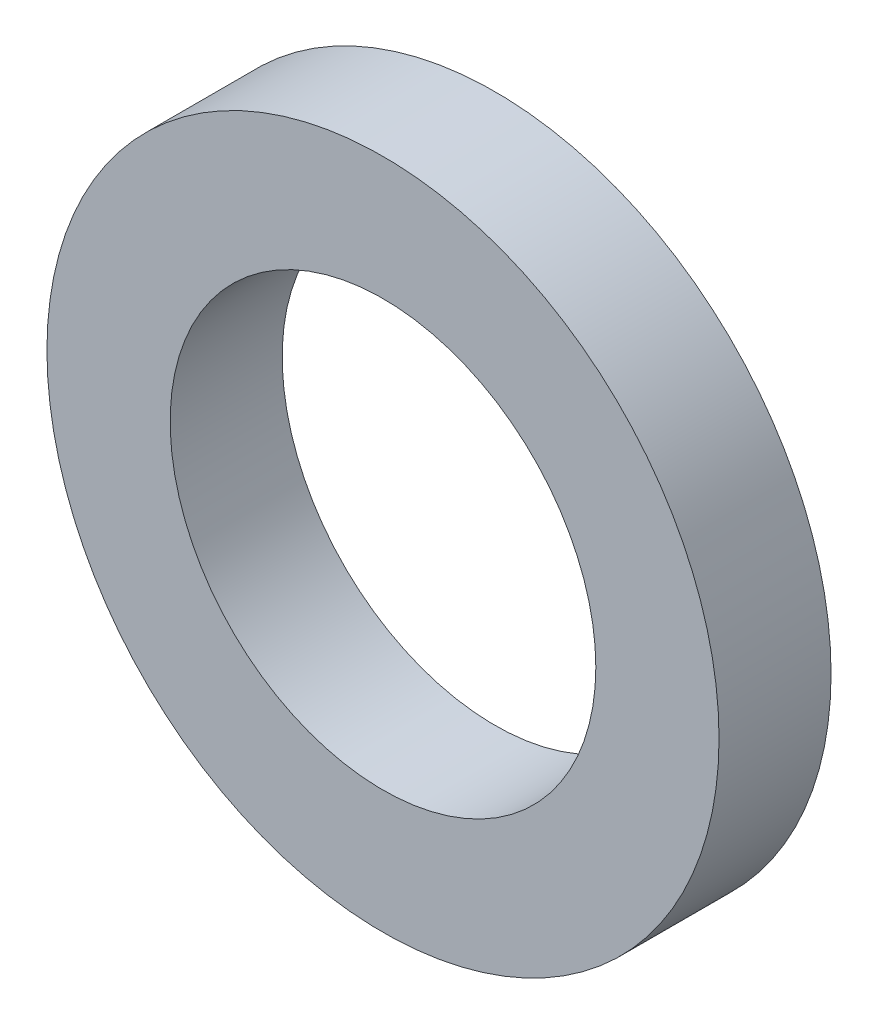
ISO-10303-21;
HEADER;
FILE_DESCRIPTION(('STEP AP214'),'2;1');
FILE_NAME('part.step','',(''),(''),'','','');
FILE_SCHEMA(('AUTOMOTIVE_DESIGN { 1 0 10303 214 1 1 1 1 }'));
ENDSEC;
DATA;
#1=APPLICATION_CONTEXT('core data for automotive mechanical design processes');
#2=APPLICATION_PROTOCOL_DEFINITION('international standard','automotive_design',2000,#1);
#3=PRODUCT_CONTEXT('',#1,'mechanical');
#4=PRODUCT('Part','Part','',(#3));
#5=PRODUCT_RELATED_PRODUCT_CATEGORY('part','',(#4));
#6=PRODUCT_DEFINITION_FORMATION('','',#4);
#7=PRODUCT_DEFINITION_CONTEXT('part definition',#1,'design');
#8=PRODUCT_DEFINITION('design','',#6,#7);
#9=PRODUCT_DEFINITION_SHAPE('','',#8);
#10=(LENGTH_UNIT() NAMED_UNIT(*) SI_UNIT(.MILLI.,.METRE.));
#11=(NAMED_UNIT(*) PLANE_ANGLE_UNIT() SI_UNIT($,.RADIAN.));
#12=(NAMED_UNIT(*) SI_UNIT($,.STERADIAN.) SOLID_ANGLE_UNIT());
#13=UNCERTAINTY_MEASURE_WITH_UNIT(LENGTH_MEASURE(1.E-05),#10,'distance_accuracy_value','');
#14=(GEOMETRIC_REPRESENTATION_CONTEXT(3) GLOBAL_UNCERTAINTY_ASSIGNED_CONTEXT((#13)) GLOBAL_UNIT_ASSIGNED_CONTEXT((#10,
#11,#12)) REPRESENTATION_CONTEXT('',''));
#15=CARTESIAN_POINT('',(0.,0.,0.));
#16=DIRECTION('',(0.,0.,1.));
#17=DIRECTION('',(1.,0.,0.));
#18=AXIS2_PLACEMENT_3D('',#15,#16,#17);
#19=CARTESIAN_POINT('',(0.,0.,1.));
#20=DIRECTION('',(0.,0.,-1.));
#21=DIRECTION('',(-1.,0.,0.));
#22=AXIS2_PLACEMENT_3D('',#19,#20,#21);
#23=CYLINDRICAL_SURFACE('',#22,3.);
#24=CARTESIAN_POINT('',(0.,0.,1.));
#25=DIRECTION('',(0.,0.,1.));
#26=DIRECTION('',(1.,0.,0.));
#27=AXIS2_PLACEMENT_3D('',#24,#25,#26);
#28=CIRCLE('',#27,3.);
#29=CARTESIAN_POINT('',(3.,0.,1.));
#30=VERTEX_POINT('',#29);
#31=EDGE_CURVE('E10',#30,#30,#28,.T.);
#32=ORIENTED_EDGE('',*,*,#31,.F.);
#33=EDGE_LOOP('',(#32));
#34=FACE_BOUND('',#33,.T.);
#35=CARTESIAN_POINT('',(0.,0.,0.));
#36=DIRECTION('',(0.,0.,1.));
#37=DIRECTION('',(1.,0.,0.));
#38=AXIS2_PLACEMENT_3D('',#35,#36,#37);
#39=CIRCLE('',#38,3.);
#40=CARTESIAN_POINT('',(3.,0.,0.));
#41=VERTEX_POINT('',#40);
#42=EDGE_CURVE('E51',#41,#41,#39,.T.);
#43=ORIENTED_EDGE('',*,*,#42,.T.);
#44=EDGE_LOOP('',(#43));
#45=FACE_BOUND('',#44,.T.);
#46=ADVANCED_FACE('F48',(#34,#45),#23,.T.);
#47=CARTESIAN_POINT('',(0.,0.,1.));
#48=DIRECTION('',(0.,0.,1.));
#49=DIRECTION('',(1.,0.,0.));
#50=AXIS2_PLACEMENT_3D('',#47,#48,#49);
#51=PLANE('',#50);
#52=CARTESIAN_POINT('',(0.,0.,1.));
#53=DIRECTION('',(0.,0.,1.));
#54=DIRECTION('',(1.,0.,0.));
#55=AXIS2_PLACEMENT_3D('',#52,#53,#54);
#56=CIRCLE('',#55,1.9);
#57=CARTESIAN_POINT('',(1.9,0.,1.));
#58=VERTEX_POINT('',#57);
#59=EDGE_CURVE('E62',#58,#58,#56,.T.);
#60=ORIENTED_EDGE('',*,*,#59,.F.);
#61=EDGE_LOOP('',(#60));
#62=FACE_BOUND('',#61,.T.);
#63=ORIENTED_EDGE('',*,*,#31,.T.);
#64=EDGE_LOOP('',(#63));
#65=FACE_BOUND('',#64,.T.);
#66=ADVANCED_FACE('F79',(#62,#65),#51,.T.);
#67=CARTESIAN_POINT('',(0.,0.,0.));
#68=DIRECTION('',(0.,0.,1.));
#69=DIRECTION('',(1.,0.,0.));
#70=AXIS2_PLACEMENT_3D('',#67,#68,#69);
#71=PLANE('',#70);
#72=CARTESIAN_POINT('',(0.,0.,0.));
#73=DIRECTION('',(0.,0.,1.));
#74=DIRECTION('',(1.,0.,0.));
#75=AXIS2_PLACEMENT_3D('',#72,#73,#74);
#76=CIRCLE('',#75,1.9);
#77=CARTESIAN_POINT('',(1.9,0.,0.));
#78=VERTEX_POINT('',#77);
#79=EDGE_CURVE('E60',#78,#78,#76,.T.);
#80=ORIENTED_EDGE('',*,*,#79,.T.);
#81=EDGE_LOOP('',(#80));
#82=FACE_BOUND('',#81,.T.);
#83=ORIENTED_EDGE('',*,*,#42,.F.);
#84=EDGE_LOOP('',(#83));
#85=FACE_BOUND('',#84,.T.);
#86=ADVANCED_FACE('F70',(#82,#85),#71,.F.);
#87=CARTESIAN_POINT('',(0.,0.,0.));
#88=DIRECTION('',(0.,0.,1.));
#89=DIRECTION('',(1.,0.,0.));
#90=AXIS2_PLACEMENT_3D('',#87,#88,#89);
#91=CYLINDRICAL_SURFACE('',#90,1.9);
#92=ORIENTED_EDGE('',*,*,#79,.F.);
#93=EDGE_LOOP('',(#92));
#94=FACE_BOUND('',#93,.T.);
#95=ORIENTED_EDGE('',*,*,#59,.T.);
#96=EDGE_LOOP('',(#95));
#97=FACE_BOUND('',#96,.T.);
#98=ADVANCED_FACE('F73',(#94,#97),#91,.F.);
#99=CLOSED_SHELL('',(#46,#66,#86,#98));
#100=MANIFOLD_SOLID_BREP('B2',#99);
#101=ADVANCED_BREP_SHAPE_REPRESENTATION('',(#18,#100),#14);
#102=SHAPE_DEFINITION_REPRESENTATION(#9,#101);
ENDSEC;
END-ISO-10303-21;
